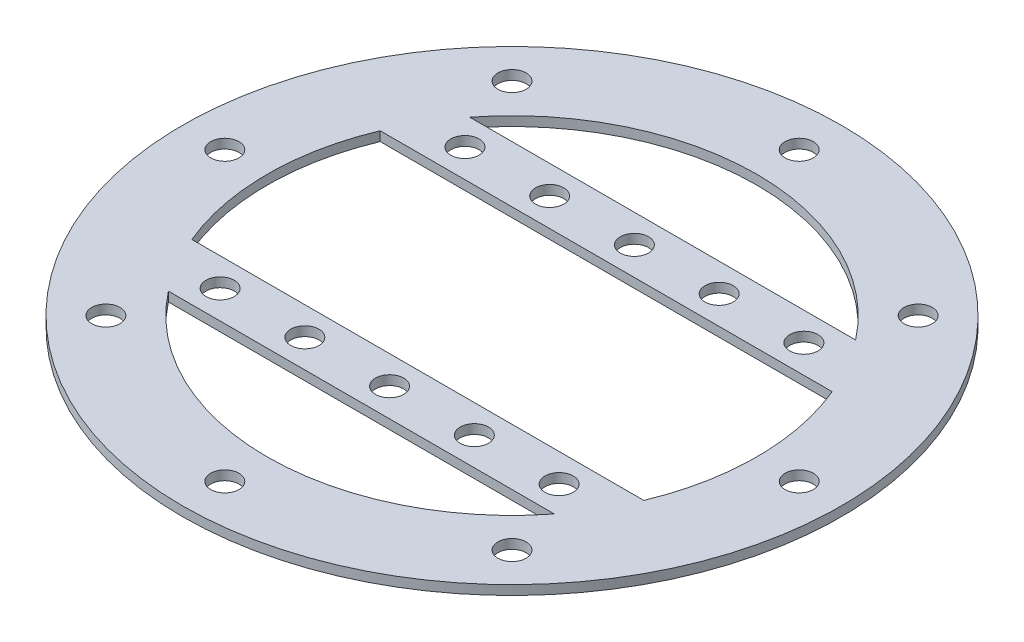
ISO-10303-21;
HEADER;
FILE_DESCRIPTION(('STEP AP214'),'2;1');
FILE_NAME('part.step','',(''),(''),'','','');
FILE_SCHEMA(('AUTOMOTIVE_DESIGN { 1 0 10303 214 1 1 1 1 }'));
ENDSEC;
DATA;
#1=APPLICATION_CONTEXT('core data for automotive mechanical design processes');
#2=APPLICATION_PROTOCOL_DEFINITION('international standard','automotive_design',2000,#1);
#3=PRODUCT_CONTEXT('',#1,'mechanical');
#4=PRODUCT('Part','Part','',(#3));
#5=PRODUCT_RELATED_PRODUCT_CATEGORY('part','',(#4));
#6=PRODUCT_DEFINITION_FORMATION('','',#4);
#7=PRODUCT_DEFINITION_CONTEXT('part definition',#1,'design');
#8=PRODUCT_DEFINITION('design','',#6,#7);
#9=PRODUCT_DEFINITION_SHAPE('','',#8);
#10=(LENGTH_UNIT() NAMED_UNIT(*) SI_UNIT(.MILLI.,.METRE.));
#11=(NAMED_UNIT(*) PLANE_ANGLE_UNIT() SI_UNIT($,.RADIAN.));
#12=(NAMED_UNIT(*) SI_UNIT($,.STERADIAN.) SOLID_ANGLE_UNIT());
#13=UNCERTAINTY_MEASURE_WITH_UNIT(LENGTH_MEASURE(1.E-05),#10,'distance_accuracy_value','');
#14=(GEOMETRIC_REPRESENTATION_CONTEXT(3) GLOBAL_UNCERTAINTY_ASSIGNED_CONTEXT((#13)) GLOBAL_UNIT_ASSIGNED_CONTEXT((#10,
#11,#12)) REPRESENTATION_CONTEXT('',''));
#15=CARTESIAN_POINT('',(0.,0.,0.));
#16=DIRECTION('',(0.,0.,1.));
#17=DIRECTION('',(1.,0.,0.));
#18=AXIS2_PLACEMENT_3D('',#15,#16,#17);
#19=CARTESIAN_POINT('',(0.,1.,-9.99999999999999));
#20=DIRECTION('',(0.,0.,-1.));
#21=DIRECTION('',(-1.,0.,0.));
#22=AXIS2_PLACEMENT_3D('',#19,#20,#21);
#23=PLANE('',#22);
#24=DIRECTION('',(1.,0.,0.));
#25=VECTOR('',#24,1.);
#26=CARTESIAN_POINT('',(0.,0.,-9.99999999999999));
#27=LINE('',#26,#25);
#28=CARTESIAN_POINT('',(-24.,0.,-9.99999999999999));
#29=VERTEX_POINT('',#28);
#30=CARTESIAN_POINT('',(24.,0.,-10.));
#31=VERTEX_POINT('',#30);
#32=EDGE_CURVE('E235',#29,#31,#27,.T.);
#33=ORIENTED_EDGE('',*,*,#32,.T.);
#34=DIRECTION('',(0.,-1.,0.));
#35=VECTOR('',#34,1.);
#36=CARTESIAN_POINT('',(24.,1.,-10.));
#37=LINE('',#36,#35);
#38=CARTESIAN_POINT('',(24.,1.,-10.));
#39=VERTEX_POINT('',#38);
#40=EDGE_CURVE('E11',#39,#31,#37,.T.);
#41=ORIENTED_EDGE('',*,*,#40,.F.);
#42=DIRECTION('',(1.,0.,0.));
#43=VECTOR('',#42,1.);
#44=CARTESIAN_POINT('',(0.,1.,-9.99999999999999));
#45=LINE('',#44,#43);
#46=CARTESIAN_POINT('',(-24.,1.,-9.99999999999999));
#47=VERTEX_POINT('',#46);
#48=EDGE_CURVE('E130',#47,#39,#45,.T.);
#49=ORIENTED_EDGE('',*,*,#48,.F.);
#50=DIRECTION('',(0.,-1.,0.));
#51=VECTOR('',#50,1.);
#52=CARTESIAN_POINT('',(-24.,1.,-9.99999999999999));
#53=LINE('',#52,#51);
#54=EDGE_CURVE('E61',#47,#29,#53,.T.);
#55=ORIENTED_EDGE('',*,*,#54,.T.);
#56=EDGE_LOOP('',(#33,#41,#49,#55));
#57=FACE_BOUND('',#56,.T.);
#58=ADVANCED_FACE('F41',(#57),#23,.F.);
#59=CARTESIAN_POINT('',(0.,1.,0.));
#60=DIRECTION('',(0.,-1.,0.));
#61=DIRECTION('',(0.,0.,-1.));
#62=AXIS2_PLACEMENT_3D('',#59,#60,#61);
#63=CYLINDRICAL_SURFACE('',#62,26.);
#64=CARTESIAN_POINT('',(0.,0.,0.));
#65=DIRECTION('',(0.,1.,0.));
#66=DIRECTION('',(0.,0.,1.));
#67=AXIS2_PLACEMENT_3D('',#64,#65,#66);
#68=CIRCLE('',#67,26.);
#69=CARTESIAN_POINT('',(24.,0.,9.99999999999999));
#70=VERTEX_POINT('',#69);
#71=EDGE_CURVE('E118',#70,#31,#68,.T.);
#72=ORIENTED_EDGE('',*,*,#71,.F.);
#73=DIRECTION('',(0.,-1.,0.));
#74=VECTOR('',#73,1.);
#75=CARTESIAN_POINT('',(24.,1.,9.99999999999999));
#76=LINE('',#75,#74);
#77=CARTESIAN_POINT('',(24.,1.,9.99999999999999));
#78=VERTEX_POINT('',#77);
#79=EDGE_CURVE('E52',#78,#70,#76,.T.);
#80=ORIENTED_EDGE('',*,*,#79,.F.);
#81=CARTESIAN_POINT('',(0.,1.,0.));
#82=DIRECTION('',(0.,1.,0.));
#83=DIRECTION('',(0.,0.,1.));
#84=AXIS2_PLACEMENT_3D('',#81,#82,#83);
#85=CIRCLE('',#84,26.);
#86=EDGE_CURVE('E116',#78,#39,#85,.T.);
#87=ORIENTED_EDGE('',*,*,#86,.T.);
#88=ORIENTED_EDGE('',*,*,#40,.T.);
#89=EDGE_LOOP('',(#72,#80,#87,#88));
#90=FACE_BOUND('',#89,.T.);
#91=ADVANCED_FACE('F115',(#90),#63,.F.);
#92=CARTESIAN_POINT('',(0.,1.,9.99999999999999));
#93=DIRECTION('',(0.,0.,-1.));
#94=DIRECTION('',(-1.,0.,0.));
#95=AXIS2_PLACEMENT_3D('',#92,#93,#94);
#96=PLANE('',#95);
#97=DIRECTION('',(1.,0.,0.));
#98=VECTOR('',#97,1.);
#99=CARTESIAN_POINT('',(0.,0.,9.99999999999999));
#100=LINE('',#99,#98);
#101=CARTESIAN_POINT('',(-24.,0.,10.));
#102=VERTEX_POINT('',#101);
#103=EDGE_CURVE('E238',#102,#70,#100,.T.);
#104=ORIENTED_EDGE('',*,*,#103,.F.);
#105=DIRECTION('',(0.,-1.,0.));
#106=VECTOR('',#105,1.);
#107=CARTESIAN_POINT('',(-24.,1.,10.));
#108=LINE('',#107,#106);
#109=CARTESIAN_POINT('',(-24.,1.,10.));
#110=VERTEX_POINT('',#109);
#111=EDGE_CURVE('E86',#110,#102,#108,.T.);
#112=ORIENTED_EDGE('',*,*,#111,.F.);
#113=DIRECTION('',(1.,0.,0.));
#114=VECTOR('',#113,1.);
#115=CARTESIAN_POINT('',(0.,1.,9.99999999999999));
#116=LINE('',#115,#114);
#117=EDGE_CURVE('E129',#110,#78,#116,.T.);
#118=ORIENTED_EDGE('',*,*,#117,.T.);
#119=ORIENTED_EDGE('',*,*,#79,.T.);
#120=EDGE_LOOP('',(#104,#112,#118,#119));
#121=FACE_BOUND('',#120,.T.);
#122=ADVANCED_FACE('F136',(#121),#96,.T.);
#123=CARTESIAN_POINT('',(20.4939015319192,0.,-16.));
#124=VERTEX_POINT('',#123);
#125=CARTESIAN_POINT('',(-20.4939015319192,0.,-16.));
#126=VERTEX_POINT('',#125);
#127=EDGE_CURVE('E207',#124,#126,#68,.T.);
#128=ORIENTED_EDGE('',*,*,#127,.F.);
#129=DIRECTION('',(0.,-1.,0.));
#130=VECTOR('',#129,1.);
#131=CARTESIAN_POINT('',(20.4939015319192,1.,-16.));
#132=LINE('',#131,#130);
#133=CARTESIAN_POINT('',(20.4939015319192,1.,-16.));
#134=VERTEX_POINT('',#133);
#135=EDGE_CURVE('E299',#134,#124,#132,.T.);
#136=ORIENTED_EDGE('',*,*,#135,.F.);
#137=CARTESIAN_POINT('',(-20.4939015319192,1.,-16.));
#138=VERTEX_POINT('',#137);
#139=EDGE_CURVE('E134',#134,#138,#85,.T.);
#140=ORIENTED_EDGE('',*,*,#139,.T.);
#141=DIRECTION('',(0.,-1.,0.));
#142=VECTOR('',#141,1.);
#143=CARTESIAN_POINT('',(-20.4939015319192,1.,-16.));
#144=LINE('',#143,#142);
#145=EDGE_CURVE('E302',#138,#126,#144,.T.);
#146=ORIENTED_EDGE('',*,*,#145,.T.);
#147=EDGE_LOOP('',(#128,#136,#140,#146));
#148=FACE_BOUND('',#147,.T.);
#149=ADVANCED_FACE('F319',(#148),#63,.F.);
#150=CARTESIAN_POINT('',(-20.4939015319192,0.,16.));
#151=VERTEX_POINT('',#150);
#152=CARTESIAN_POINT('',(20.4939015319192,0.,16.));
#153=VERTEX_POINT('',#152);
#154=EDGE_CURVE('E201',#151,#153,#68,.T.);
#155=ORIENTED_EDGE('',*,*,#154,.F.);
#156=DIRECTION('',(0.,-1.,0.));
#157=VECTOR('',#156,1.);
#158=CARTESIAN_POINT('',(-20.4939015319192,1.,16.));
#159=LINE('',#158,#157);
#160=CARTESIAN_POINT('',(-20.4939015319192,1.,16.));
#161=VERTEX_POINT('',#160);
#162=EDGE_CURVE('E45',#161,#151,#159,.T.);
#163=ORIENTED_EDGE('',*,*,#162,.F.);
#164=CARTESIAN_POINT('',(20.4939015319192,1.,16.));
#165=VERTEX_POINT('',#164);
#166=EDGE_CURVE('E141',#161,#165,#85,.T.);
#167=ORIENTED_EDGE('',*,*,#166,.T.);
#168=DIRECTION('',(0.,-1.,0.));
#169=VECTOR('',#168,1.);
#170=CARTESIAN_POINT('',(20.4939015319192,1.,16.));
#171=LINE('',#170,#169);
#172=EDGE_CURVE('E200',#165,#153,#171,.T.);
#173=ORIENTED_EDGE('',*,*,#172,.T.);
#174=EDGE_LOOP('',(#155,#163,#167,#173));
#175=FACE_BOUND('',#174,.T.);
#176=ADVANCED_FACE('F316',(#175),#63,.F.);
#177=CARTESIAN_POINT('',(-9.,1.,13.));
#178=DIRECTION('',(0.,-1.,0.));
#179=DIRECTION('',(0.,0.,-1.));
#180=AXIS2_PLACEMENT_3D('',#177,#178,#179);
#181=CYLINDRICAL_SURFACE('',#180,1.5);
#182=CARTESIAN_POINT('',(-9.,1.,13.));
#183=DIRECTION('',(0.,1.,0.));
#184=DIRECTION('',(0.,0.,1.));
#185=AXIS2_PLACEMENT_3D('',#182,#183,#184);
#186=CIRCLE('',#185,1.5);
#187=CARTESIAN_POINT('',(-9.,1.,14.5));
#188=VERTEX_POINT('',#187);
#189=EDGE_CURVE('E192',#188,#188,#186,.T.);
#190=ORIENTED_EDGE('',*,*,#189,.T.);
#191=EDGE_LOOP('',(#190));
#192=FACE_BOUND('',#191,.T.);
#193=CARTESIAN_POINT('',(-9.,0.,13.));
#194=DIRECTION('',(0.,1.,0.));
#195=DIRECTION('',(0.,0.,1.));
#196=AXIS2_PLACEMENT_3D('',#193,#194,#195);
#197=CIRCLE('',#196,1.5);
#198=CARTESIAN_POINT('',(-9.,0.,14.5));
#199=VERTEX_POINT('',#198);
#200=EDGE_CURVE('E289',#199,#199,#197,.T.);
#201=ORIENTED_EDGE('',*,*,#200,.F.);
#202=EDGE_LOOP('',(#201));
#203=FACE_BOUND('',#202,.T.);
#204=ADVANCED_FACE('F318',(#192,#203),#181,.F.);
#205=CARTESIAN_POINT('',(0.,1.,13.));
#206=DIRECTION('',(0.,-1.,0.));
#207=DIRECTION('',(0.,0.,-1.));
#208=AXIS2_PLACEMENT_3D('',#205,#206,#207);
#209=CYLINDRICAL_SURFACE('',#208,1.5);
#210=CARTESIAN_POINT('',(0.,1.,13.));
#211=DIRECTION('',(0.,1.,0.));
#212=DIRECTION('',(0.,0.,1.));
#213=AXIS2_PLACEMENT_3D('',#210,#211,#212);
#214=CIRCLE('',#213,1.5);
#215=CARTESIAN_POINT('',(0.,1.,14.5));
#216=VERTEX_POINT('',#215);
#217=EDGE_CURVE('E188',#216,#216,#214,.T.);
#218=ORIENTED_EDGE('',*,*,#217,.T.);
#219=EDGE_LOOP('',(#218));
#220=FACE_BOUND('',#219,.T.);
#221=CARTESIAN_POINT('',(0.,0.,13.));
#222=DIRECTION('',(0.,1.,0.));
#223=DIRECTION('',(0.,0.,1.));
#224=AXIS2_PLACEMENT_3D('',#221,#222,#223);
#225=CIRCLE('',#224,1.5);
#226=CARTESIAN_POINT('',(0.,0.,14.5));
#227=VERTEX_POINT('',#226);
#228=EDGE_CURVE('E285',#227,#227,#225,.T.);
#229=ORIENTED_EDGE('',*,*,#228,.F.);
#230=EDGE_LOOP('',(#229));
#231=FACE_BOUND('',#230,.T.);
#232=ADVANCED_FACE('F326',(#220,#231),#209,.F.);
#233=CARTESIAN_POINT('',(9.,1.,13.));
#234=DIRECTION('',(0.,-1.,0.));
#235=DIRECTION('',(0.,0.,-1.));
#236=AXIS2_PLACEMENT_3D('',#233,#234,#235);
#237=CYLINDRICAL_SURFACE('',#236,1.5);
#238=CARTESIAN_POINT('',(9.,1.,13.));
#239=DIRECTION('',(0.,1.,0.));
#240=DIRECTION('',(0.,0.,1.));
#241=AXIS2_PLACEMENT_3D('',#238,#239,#240);
#242=CIRCLE('',#241,1.5);
#243=CARTESIAN_POINT('',(9.,1.,14.5));
#244=VERTEX_POINT('',#243);
#245=EDGE_CURVE('E184',#244,#244,#242,.T.);
#246=ORIENTED_EDGE('',*,*,#245,.T.);
#247=EDGE_LOOP('',(#246));
#248=FACE_BOUND('',#247,.T.);
#249=CARTESIAN_POINT('',(9.,0.,13.));
#250=DIRECTION('',(0.,1.,0.));
#251=DIRECTION('',(0.,0.,1.));
#252=AXIS2_PLACEMENT_3D('',#249,#250,#251);
#253=CIRCLE('',#252,1.5);
#254=CARTESIAN_POINT('',(9.,0.,14.5));
#255=VERTEX_POINT('',#254);
#256=EDGE_CURVE('E281',#255,#255,#253,.T.);
#257=ORIENTED_EDGE('',*,*,#256,.F.);
#258=EDGE_LOOP('',(#257));
#259=FACE_BOUND('',#258,.T.);
#260=ADVANCED_FACE('F437',(#248,#259),#237,.F.);
#261=CARTESIAN_POINT('',(18.,1.,13.));
#262=DIRECTION('',(0.,-1.,0.));
#263=DIRECTION('',(0.,0.,-1.));
#264=AXIS2_PLACEMENT_3D('',#261,#262,#263);
#265=CYLINDRICAL_SURFACE('',#264,1.5);
#266=CARTESIAN_POINT('',(18.,1.,13.));
#267=DIRECTION('',(0.,1.,0.));
#268=DIRECTION('',(0.,0.,1.));
#269=AXIS2_PLACEMENT_3D('',#266,#267,#268);
#270=CIRCLE('',#269,1.5);
#271=CARTESIAN_POINT('',(18.,1.,14.5));
#272=VERTEX_POINT('',#271);
#273=EDGE_CURVE('E180',#272,#272,#270,.T.);
#274=ORIENTED_EDGE('',*,*,#273,.T.);
#275=EDGE_LOOP('',(#274));
#276=FACE_BOUND('',#275,.T.);
#277=CARTESIAN_POINT('',(18.,0.,13.));
#278=DIRECTION('',(0.,1.,0.));
#279=DIRECTION('',(0.,0.,1.));
#280=AXIS2_PLACEMENT_3D('',#277,#278,#279);
#281=CIRCLE('',#280,1.5);
#282=CARTESIAN_POINT('',(18.,0.,14.5));
#283=VERTEX_POINT('',#282);
#284=EDGE_CURVE('E277',#283,#283,#281,.T.);
#285=ORIENTED_EDGE('',*,*,#284,.F.);
#286=EDGE_LOOP('',(#285));
#287=FACE_BOUND('',#286,.T.);
#288=ADVANCED_FACE('F441',(#276,#287),#265,.F.);
#289=CARTESIAN_POINT('',(0.,1.,0.));
#290=DIRECTION('',(0.,-1.,0.));
#291=DIRECTION('',(0.,0.,-1.));
#292=AXIS2_PLACEMENT_3D('',#289,#290,#291);
#293=CYLINDRICAL_SURFACE('',#292,35.);
#294=CARTESIAN_POINT('',(0.,1.,0.));
#295=DIRECTION('',(0.,1.,0.));
#296=DIRECTION('',(0.,0.,1.));
#297=AXIS2_PLACEMENT_3D('',#294,#295,#296);
#298=CIRCLE('',#297,35.);
#299=CARTESIAN_POINT('',(0.,1.,35.));
#300=VERTEX_POINT('',#299);
#301=EDGE_CURVE('E176',#300,#300,#298,.T.);
#302=ORIENTED_EDGE('',*,*,#301,.F.);
#303=EDGE_LOOP('',(#302));
#304=FACE_BOUND('',#303,.T.);
#305=CARTESIAN_POINT('',(0.,0.,0.));
#306=DIRECTION('',(0.,1.,0.));
#307=DIRECTION('',(0.,0.,1.));
#308=AXIS2_PLACEMENT_3D('',#305,#306,#307);
#309=CIRCLE('',#308,35.);
#310=CARTESIAN_POINT('',(0.,0.,35.));
#311=VERTEX_POINT('',#310);
#312=EDGE_CURVE('E273',#311,#311,#309,.T.);
#313=ORIENTED_EDGE('',*,*,#312,.T.);
#314=EDGE_LOOP('',(#313));
#315=FACE_BOUND('',#314,.T.);
#316=ADVANCED_FACE('F445',(#304,#315),#293,.T.);
#317=CARTESIAN_POINT('',(0.,1.,-30.5));
#318=DIRECTION('',(0.,-1.,0.));
#319=DIRECTION('',(0.,0.,-1.));
#320=AXIS2_PLACEMENT_3D('',#317,#318,#319);
#321=CYLINDRICAL_SURFACE('',#320,1.5);
#322=CARTESIAN_POINT('',(0.,1.,-30.5));
#323=DIRECTION('',(0.,1.,0.));
#324=DIRECTION('',(0.,0.,1.));
#325=AXIS2_PLACEMENT_3D('',#322,#323,#324);
#326=CIRCLE('',#325,1.5);
#327=CARTESIAN_POINT('',(0.,1.,-29.));
#328=VERTEX_POINT('',#327);
#329=EDGE_CURVE('E172',#328,#328,#326,.T.);
#330=ORIENTED_EDGE('',*,*,#329,.T.);
#331=EDGE_LOOP('',(#330));
#332=FACE_BOUND('',#331,.T.);
#333=CARTESIAN_POINT('',(0.,0.,-30.5));
#334=DIRECTION('',(0.,1.,0.));
#335=DIRECTION('',(0.,0.,1.));
#336=AXIS2_PLACEMENT_3D('',#333,#334,#335);
#337=CIRCLE('',#336,1.5);
#338=CARTESIAN_POINT('',(0.,0.,-29.));
#339=VERTEX_POINT('',#338);
#340=EDGE_CURVE('E269',#339,#339,#337,.T.);
#341=ORIENTED_EDGE('',*,*,#340,.F.);
#342=EDGE_LOOP('',(#341));
#343=FACE_BOUND('',#342,.T.);
#344=ADVANCED_FACE('F449',(#332,#343),#321,.F.);
#345=CARTESIAN_POINT('',(21.5667568261903,1.,-21.5667568261912));
#346=DIRECTION('',(0.,-1.,0.));
#347=DIRECTION('',(0.,0.,-1.));
#348=AXIS2_PLACEMENT_3D('',#345,#346,#347);
#349=CYLINDRICAL_SURFACE('',#348,1.5);
#350=CARTESIAN_POINT('',(21.5667568261903,1.,-21.5667568261912));
#351=DIRECTION('',(0.,1.,0.));
#352=DIRECTION('',(0.,0.,1.));
#353=AXIS2_PLACEMENT_3D('',#350,#351,#352);
#354=CIRCLE('',#353,1.5);
#355=CARTESIAN_POINT('',(21.5667568261903,1.,-20.0667568261912));
#356=VERTEX_POINT('',#355);
#357=EDGE_CURVE('E168',#356,#356,#354,.T.);
#358=ORIENTED_EDGE('',*,*,#357,.T.);
#359=EDGE_LOOP('',(#358));
#360=FACE_BOUND('',#359,.T.);
#361=CARTESIAN_POINT('',(21.5667568261903,0.,-21.5667568261912));
#362=DIRECTION('',(0.,1.,0.));
#363=DIRECTION('',(0.,0.,1.));
#364=AXIS2_PLACEMENT_3D('',#361,#362,#363);
#365=CIRCLE('',#364,1.5);
#366=CARTESIAN_POINT('',(21.5667568261903,0.,-20.0667568261912));
#367=VERTEX_POINT('',#366);
#368=EDGE_CURVE('E265',#367,#367,#365,.T.);
#369=ORIENTED_EDGE('',*,*,#368,.F.);
#370=EDGE_LOOP('',(#369));
#371=FACE_BOUND('',#370,.T.);
#372=ADVANCED_FACE('F453',(#360,#371),#349,.F.);
#373=CARTESIAN_POINT('',(30.5000000000022,1.,-2.17205640718744E-12));
#374=DIRECTION('',(0.,-1.,0.));
#375=DIRECTION('',(0.,0.,-1.));
#376=AXIS2_PLACEMENT_3D('',#373,#374,#375);
#377=CYLINDRICAL_SURFACE('',#376,1.5);
#378=CARTESIAN_POINT('',(30.5000000000022,1.,-2.17205640718744E-12));
#379=DIRECTION('',(0.,1.,0.));
#380=DIRECTION('',(0.,0.,1.));
#381=AXIS2_PLACEMENT_3D('',#378,#379,#380);
#382=CIRCLE('',#381,1.5);
#383=CARTESIAN_POINT('',(30.5000000000022,1.,1.49999999999783));
#384=VERTEX_POINT('',#383);
#385=EDGE_CURVE('E164',#384,#384,#382,.T.);
#386=ORIENTED_EDGE('',*,*,#385,.T.);
#387=EDGE_LOOP('',(#386));
#388=FACE_BOUND('',#387,.T.);
#389=CARTESIAN_POINT('',(30.5000000000022,0.,-2.17205640718744E-12));
#390=DIRECTION('',(0.,1.,0.));
#391=DIRECTION('',(0.,0.,1.));
#392=AXIS2_PLACEMENT_3D('',#389,#390,#391);
#393=CIRCLE('',#392,1.5);
#394=CARTESIAN_POINT('',(30.5000000000022,0.,1.49999999999783));
#395=VERTEX_POINT('',#394);
#396=EDGE_CURVE('E261',#395,#395,#393,.T.);
#397=ORIENTED_EDGE('',*,*,#396,.F.);
#398=EDGE_LOOP('',(#397));
#399=FACE_BOUND('',#398,.T.);
#400=ADVANCED_FACE('F457',(#388,#399),#377,.F.);
#401=CARTESIAN_POINT('',(21.5667568261934,1.,21.5667568261882));
#402=DIRECTION('',(0.,-1.,0.));
#403=DIRECTION('',(0.,0.,-1.));
#404=AXIS2_PLACEMENT_3D('',#401,#402,#403);
#405=CYLINDRICAL_SURFACE('',#404,1.5);
#406=CARTESIAN_POINT('',(21.5667568261934,1.,21.5667568261882));
#407=DIRECTION('',(0.,1.,0.));
#408=DIRECTION('',(0.,0.,1.));
#409=AXIS2_PLACEMENT_3D('',#406,#407,#408);
#410=CIRCLE('',#409,1.5);
#411=CARTESIAN_POINT('',(21.5667568261934,1.,23.0667568261882));
#412=VERTEX_POINT('',#411);
#413=EDGE_CURVE('E160',#412,#412,#410,.T.);
#414=ORIENTED_EDGE('',*,*,#413,.T.);
#415=EDGE_LOOP('',(#414));
#416=FACE_BOUND('',#415,.T.);
#417=CARTESIAN_POINT('',(21.5667568261934,0.,21.5667568261882));
#418=DIRECTION('',(0.,1.,0.));
#419=DIRECTION('',(0.,0.,1.));
#420=AXIS2_PLACEMENT_3D('',#417,#418,#419);
#421=CIRCLE('',#420,1.5);
#422=CARTESIAN_POINT('',(21.5667568261934,0.,23.0667568261882));
#423=VERTEX_POINT('',#422);
#424=EDGE_CURVE('E257',#423,#423,#421,.T.);
#425=ORIENTED_EDGE('',*,*,#424,.F.);
#426=EDGE_LOOP('',(#425));
#427=FACE_BOUND('',#426,.T.);
#428=ADVANCED_FACE('F461',(#416,#427),#405,.F.);
#429=CARTESIAN_POINT('',(4.34405158203492E-12,1.,30.5));
#430=DIRECTION('',(0.,-1.,0.));
#431=DIRECTION('',(0.,0.,-1.));
#432=AXIS2_PLACEMENT_3D('',#429,#430,#431);
#433=CYLINDRICAL_SURFACE('',#432,1.5);
#434=CARTESIAN_POINT('',(4.34405158203492E-12,1.,30.5));
#435=DIRECTION('',(0.,1.,0.));
#436=DIRECTION('',(0.,0.,1.));
#437=AXIS2_PLACEMENT_3D('',#434,#435,#436);
#438=CIRCLE('',#437,1.5);
#439=CARTESIAN_POINT('',(4.34405158203492E-12,1.,32.));
#440=VERTEX_POINT('',#439);
#441=EDGE_CURVE('E156',#440,#440,#438,.T.);
#442=ORIENTED_EDGE('',*,*,#441,.T.);
#443=EDGE_LOOP('',(#442));
#444=FACE_BOUND('',#443,.T.);
#445=CARTESIAN_POINT('',(4.34405158203492E-12,0.,30.5));
#446=DIRECTION('',(0.,1.,0.));
#447=DIRECTION('',(0.,0.,1.));
#448=AXIS2_PLACEMENT_3D('',#445,#446,#447);
#449=CIRCLE('',#448,1.5);
#450=CARTESIAN_POINT('',(4.34405158203492E-12,0.,32.));
#451=VERTEX_POINT('',#450);
#452=EDGE_CURVE('E253',#451,#451,#449,.T.);
#453=ORIENTED_EDGE('',*,*,#452,.F.);
#454=EDGE_LOOP('',(#453));
#455=FACE_BOUND('',#454,.T.);
#456=ADVANCED_FACE('F465',(#444,#455),#433,.F.);
#457=CARTESIAN_POINT('',(-21.566756826186,1.,21.5667568261912));
#458=DIRECTION('',(0.,-1.,0.));
#459=DIRECTION('',(0.,0.,-1.));
#460=AXIS2_PLACEMENT_3D('',#457,#458,#459);
#461=CYLINDRICAL_SURFACE('',#460,1.5);
#462=CARTESIAN_POINT('',(-21.566756826186,1.,21.5667568261912));
#463=DIRECTION('',(0.,1.,0.));
#464=DIRECTION('',(0.,0.,1.));
#465=AXIS2_PLACEMENT_3D('',#462,#463,#464);
#466=CIRCLE('',#465,1.5);
#467=CARTESIAN_POINT('',(-21.566756826186,1.,23.0667568261912));
#468=VERTEX_POINT('',#467);
#469=EDGE_CURVE('E152',#468,#468,#466,.T.);
#470=ORIENTED_EDGE('',*,*,#469,.T.);
#471=EDGE_LOOP('',(#470));
#472=FACE_BOUND('',#471,.T.);
#473=CARTESIAN_POINT('',(-21.566756826186,0.,21.5667568261912));
#474=DIRECTION('',(0.,1.,0.));
#475=DIRECTION('',(0.,0.,1.));
#476=AXIS2_PLACEMENT_3D('',#473,#474,#475);
#477=CIRCLE('',#476,1.5);
#478=CARTESIAN_POINT('',(-21.566756826186,0.,23.0667568261912));
#479=VERTEX_POINT('',#478);
#480=EDGE_CURVE('E249',#479,#479,#477,.T.);
#481=ORIENTED_EDGE('',*,*,#480,.F.);
#482=EDGE_LOOP('',(#481));
#483=FACE_BOUND('',#482,.T.);
#484=ADVANCED_FACE('F469',(#472,#483),#461,.F.);
#485=CARTESIAN_POINT('',(-30.4999999999978,1.,2.17579157992484E-12));
#486=DIRECTION('',(0.,-1.,0.));
#487=DIRECTION('',(0.,0.,-1.));
#488=AXIS2_PLACEMENT_3D('',#485,#486,#487);
#489=CYLINDRICAL_SURFACE('',#488,1.5);
#490=CARTESIAN_POINT('',(-30.4999999999978,1.,2.17579157992484E-12));
#491=DIRECTION('',(0.,1.,0.));
#492=DIRECTION('',(0.,0.,1.));
#493=AXIS2_PLACEMENT_3D('',#490,#491,#492);
#494=CIRCLE('',#493,1.5);
#495=CARTESIAN_POINT('',(-30.4999999999978,1.,1.50000000000218));
#496=VERTEX_POINT('',#495);
#497=EDGE_CURVE('E148',#496,#496,#494,.T.);
#498=ORIENTED_EDGE('',*,*,#497,.T.);
#499=EDGE_LOOP('',(#498));
#500=FACE_BOUND('',#499,.T.);
#501=CARTESIAN_POINT('',(-30.4999999999978,0.,2.17579157992484E-12));
#502=DIRECTION('',(0.,1.,0.));
#503=DIRECTION('',(0.,0.,1.));
#504=AXIS2_PLACEMENT_3D('',#501,#502,#503);
#505=CIRCLE('',#504,1.5);
#506=CARTESIAN_POINT('',(-30.4999999999978,0.,1.50000000000218));
#507=VERTEX_POINT('',#506);
#508=EDGE_CURVE('E245',#507,#507,#505,.T.);
#509=ORIENTED_EDGE('',*,*,#508,.F.);
#510=EDGE_LOOP('',(#509));
#511=FACE_BOUND('',#510,.T.);
#512=ADVANCED_FACE('F473',(#500,#511),#489,.F.);
#513=CARTESIAN_POINT('',(-21.5667568261891,1.,-21.5667568261882));
#514=DIRECTION('',(0.,-1.,0.));
#515=DIRECTION('',(0.,0.,-1.));
#516=AXIS2_PLACEMENT_3D('',#513,#514,#515);
#517=CYLINDRICAL_SURFACE('',#516,1.5);
#518=CARTESIAN_POINT('',(-21.5667568261891,1.,-21.5667568261882));
#519=DIRECTION('',(0.,1.,0.));
#520=DIRECTION('',(0.,0.,1.));
#521=AXIS2_PLACEMENT_3D('',#518,#519,#520);
#522=CIRCLE('',#521,1.5);
#523=CARTESIAN_POINT('',(-21.5667568261891,1.,-20.0667568261882));
#524=VERTEX_POINT('',#523);
#525=EDGE_CURVE('E140',#524,#524,#522,.T.);
#526=ORIENTED_EDGE('',*,*,#525,.T.);
#527=EDGE_LOOP('',(#526));
#528=FACE_BOUND('',#527,.T.);
#529=CARTESIAN_POINT('',(-21.5667568261891,0.,-21.5667568261882));
#530=DIRECTION('',(0.,1.,0.));
#531=DIRECTION('',(0.,0.,1.));
#532=AXIS2_PLACEMENT_3D('',#529,#530,#531);
#533=CIRCLE('',#532,1.5);
#534=CARTESIAN_POINT('',(-21.5667568261891,0.,-20.0667568261882));
#535=VERTEX_POINT('',#534);
#536=EDGE_CURVE('E241',#535,#535,#533,.T.);
#537=ORIENTED_EDGE('',*,*,#536,.F.);
#538=EDGE_LOOP('',(#537));
#539=FACE_BOUND('',#538,.T.);
#540=ADVANCED_FACE('F334',(#528,#539),#517,.F.);
#541=EDGE_CURVE('E206',#29,#102,#68,.T.);
#542=ORIENTED_EDGE('',*,*,#541,.F.);
#543=ORIENTED_EDGE('',*,*,#54,.F.);
#544=EDGE_CURVE('E135',#47,#110,#85,.T.);
#545=ORIENTED_EDGE('',*,*,#544,.T.);
#546=ORIENTED_EDGE('',*,*,#111,.T.);
#547=EDGE_LOOP('',(#542,#543,#545,#546));
#548=FACE_BOUND('',#547,.T.);
#549=ADVANCED_FACE('F321',(#548),#63,.F.);
#550=CARTESIAN_POINT('',(-9.,1.,-13.));
#551=DIRECTION('',(0.,-1.,0.));
#552=DIRECTION('',(0.,0.,-1.));
#553=AXIS2_PLACEMENT_3D('',#550,#551,#552);
#554=CYLINDRICAL_SURFACE('',#553,1.5);
#555=CARTESIAN_POINT('',(-9.,1.,-13.));
#556=DIRECTION('',(0.,1.,0.));
#557=DIRECTION('',(0.,0.,1.));
#558=AXIS2_PLACEMENT_3D('',#555,#556,#557);
#559=CIRCLE('',#558,1.5);
#560=CARTESIAN_POINT('',(-9.,1.,-11.5));
#561=VERTEX_POINT('',#560);
#562=EDGE_CURVE('E379',#561,#561,#559,.T.);
#563=ORIENTED_EDGE('',*,*,#562,.T.);
#564=EDGE_LOOP('',(#563));
#565=FACE_BOUND('',#564,.T.);
#566=CARTESIAN_POINT('',(-9.,0.,-13.));
#567=DIRECTION('',(0.,1.,0.));
#568=DIRECTION('',(0.,0.,1.));
#569=AXIS2_PLACEMENT_3D('',#566,#567,#568);
#570=CIRCLE('',#569,1.5);
#571=CARTESIAN_POINT('',(-9.,0.,-11.5));
#572=VERTEX_POINT('',#571);
#573=EDGE_CURVE('E231',#572,#572,#570,.T.);
#574=ORIENTED_EDGE('',*,*,#573,.F.);
#575=EDGE_LOOP('',(#574));
#576=FACE_BOUND('',#575,.T.);
#577=ADVANCED_FACE('F333',(#565,#576),#554,.F.);
#578=CARTESIAN_POINT('',(0.,1.,-13.));
#579=DIRECTION('',(0.,-1.,0.));
#580=DIRECTION('',(0.,0.,-1.));
#581=AXIS2_PLACEMENT_3D('',#578,#579,#580);
#582=CYLINDRICAL_SURFACE('',#581,1.5);
#583=CARTESIAN_POINT('',(0.,1.,-13.));
#584=DIRECTION('',(0.,1.,0.));
#585=DIRECTION('',(0.,0.,1.));
#586=AXIS2_PLACEMENT_3D('',#583,#584,#585);
#587=CIRCLE('',#586,1.5);
#588=CARTESIAN_POINT('',(0.,1.,-11.5));
#589=VERTEX_POINT('',#588);
#590=EDGE_CURVE('E382',#589,#589,#587,.T.);
#591=ORIENTED_EDGE('',*,*,#590,.T.);
#592=EDGE_LOOP('',(#591));
#593=FACE_BOUND('',#592,.T.);
#594=CARTESIAN_POINT('',(0.,0.,-13.));
#595=DIRECTION('',(0.,1.,0.));
#596=DIRECTION('',(0.,0.,1.));
#597=AXIS2_PLACEMENT_3D('',#594,#595,#596);
#598=CIRCLE('',#597,1.5);
#599=CARTESIAN_POINT('',(0.,0.,-11.5));
#600=VERTEX_POINT('',#599);
#601=EDGE_CURVE('E227',#600,#600,#598,.T.);
#602=ORIENTED_EDGE('',*,*,#601,.F.);
#603=EDGE_LOOP('',(#602));
#604=FACE_BOUND('',#603,.T.);
#605=ADVANCED_FACE('F343',(#593,#604),#582,.F.);
#606=CARTESIAN_POINT('',(9.,1.,-13.));
#607=DIRECTION('',(0.,-1.,0.));
#608=DIRECTION('',(0.,0.,-1.));
#609=AXIS2_PLACEMENT_3D('',#606,#607,#608);
#610=CYLINDRICAL_SURFACE('',#609,1.5);
#611=CARTESIAN_POINT('',(9.,1.,-13.));
#612=DIRECTION('',(0.,1.,0.));
#613=DIRECTION('',(0.,0.,1.));
#614=AXIS2_PLACEMENT_3D('',#611,#612,#613);
#615=CIRCLE('',#614,1.5);
#616=CARTESIAN_POINT('',(9.,1.,-11.5));
#617=VERTEX_POINT('',#616);
#618=EDGE_CURVE('E386',#617,#617,#615,.T.);
#619=ORIENTED_EDGE('',*,*,#618,.T.);
#620=EDGE_LOOP('',(#619));
#621=FACE_BOUND('',#620,.T.);
#622=CARTESIAN_POINT('',(9.,0.,-13.));
#623=DIRECTION('',(0.,1.,0.));
#624=DIRECTION('',(0.,0.,1.));
#625=AXIS2_PLACEMENT_3D('',#622,#623,#624);
#626=CIRCLE('',#625,1.5);
#627=CARTESIAN_POINT('',(9.,0.,-11.5));
#628=VERTEX_POINT('',#627);
#629=EDGE_CURVE('E223',#628,#628,#626,.T.);
#630=ORIENTED_EDGE('',*,*,#629,.F.);
#631=EDGE_LOOP('',(#630));
#632=FACE_BOUND('',#631,.T.);
#633=ADVANCED_FACE('F347',(#621,#632),#610,.F.);
#634=CARTESIAN_POINT('',(18.,1.,-13.));
#635=DIRECTION('',(0.,-1.,0.));
#636=DIRECTION('',(0.,0.,-1.));
#637=AXIS2_PLACEMENT_3D('',#634,#635,#636);
#638=CYLINDRICAL_SURFACE('',#637,1.5);
#639=CARTESIAN_POINT('',(18.,1.,-13.));
#640=DIRECTION('',(0.,1.,0.));
#641=DIRECTION('',(0.,0.,1.));
#642=AXIS2_PLACEMENT_3D('',#639,#640,#641);
#643=CIRCLE('',#642,1.5);
#644=CARTESIAN_POINT('',(18.,1.,-11.5));
#645=VERTEX_POINT('',#644);
#646=EDGE_CURVE('E392',#645,#645,#643,.T.);
#647=ORIENTED_EDGE('',*,*,#646,.T.);
#648=EDGE_LOOP('',(#647));
#649=FACE_BOUND('',#648,.T.);
#650=CARTESIAN_POINT('',(18.,0.,-13.));
#651=DIRECTION('',(0.,1.,0.));
#652=DIRECTION('',(0.,0.,1.));
#653=AXIS2_PLACEMENT_3D('',#650,#651,#652);
#654=CIRCLE('',#653,1.5);
#655=CARTESIAN_POINT('',(18.,0.,-11.5));
#656=VERTEX_POINT('',#655);
#657=EDGE_CURVE('E219',#656,#656,#654,.T.);
#658=ORIENTED_EDGE('',*,*,#657,.F.);
#659=EDGE_LOOP('',(#658));
#660=FACE_BOUND('',#659,.T.);
#661=ADVANCED_FACE('F351',(#649,#660),#638,.F.);
#662=CARTESIAN_POINT('',(-18.,1.,-13.));
#663=DIRECTION('',(0.,-1.,0.));
#664=DIRECTION('',(0.,0.,-1.));
#665=AXIS2_PLACEMENT_3D('',#662,#663,#664);
#666=CYLINDRICAL_SURFACE('',#665,1.5);
#667=CARTESIAN_POINT('',(-18.,1.,-13.));
#668=DIRECTION('',(0.,1.,0.));
#669=DIRECTION('',(0.,0.,1.));
#670=AXIS2_PLACEMENT_3D('',#667,#668,#669);
#671=CIRCLE('',#670,1.5);
#672=CARTESIAN_POINT('',(-18.,1.,-11.5));
#673=VERTEX_POINT('',#672);
#674=EDGE_CURVE('E396',#673,#673,#671,.T.);
#675=ORIENTED_EDGE('',*,*,#674,.T.);
#676=EDGE_LOOP('',(#675));
#677=FACE_BOUND('',#676,.T.);
#678=CARTESIAN_POINT('',(-18.,0.,-13.));
#679=DIRECTION('',(0.,1.,0.));
#680=DIRECTION('',(0.,0.,1.));
#681=AXIS2_PLACEMENT_3D('',#678,#679,#680);
#682=CIRCLE('',#681,1.5);
#683=CARTESIAN_POINT('',(-18.,0.,-11.5));
#684=VERTEX_POINT('',#683);
#685=EDGE_CURVE('E215',#684,#684,#682,.T.);
#686=ORIENTED_EDGE('',*,*,#685,.F.);
#687=EDGE_LOOP('',(#686));
#688=FACE_BOUND('',#687,.T.);
#689=ADVANCED_FACE('F355',(#677,#688),#666,.F.);
#690=CARTESIAN_POINT('',(0.,1.,-16.));
#691=DIRECTION('',(0.,0.,-1.));
#692=DIRECTION('',(-1.,0.,0.));
#693=AXIS2_PLACEMENT_3D('',#690,#691,#692);
#694=PLANE('',#693);
#695=DIRECTION('',(1.,0.,0.));
#696=VECTOR('',#695,1.);
#697=CARTESIAN_POINT('',(0.,0.,-16.));
#698=LINE('',#697,#696);
#699=EDGE_CURVE('E211',#126,#124,#698,.T.);
#700=ORIENTED_EDGE('',*,*,#699,.F.);
#701=ORIENTED_EDGE('',*,*,#145,.F.);
#702=DIRECTION('',(1.,0.,0.));
#703=VECTOR('',#702,1.);
#704=CARTESIAN_POINT('',(0.,1.,-16.));
#705=LINE('',#704,#703);
#706=EDGE_CURVE('E400',#138,#134,#705,.T.);
#707=ORIENTED_EDGE('',*,*,#706,.T.);
#708=ORIENTED_EDGE('',*,*,#135,.T.);
#709=EDGE_LOOP('',(#700,#701,#707,#708));
#710=FACE_BOUND('',#709,.T.);
#711=ADVANCED_FACE('F358',(#710),#694,.T.);
#712=CARTESIAN_POINT('',(0.,1.,16.));
#713=DIRECTION('',(0.,0.,-1.));
#714=DIRECTION('',(-1.,0.,0.));
#715=AXIS2_PLACEMENT_3D('',#712,#713,#714);
#716=PLANE('',#715);
#717=DIRECTION('',(1.,0.,0.));
#718=VECTOR('',#717,1.);
#719=CARTESIAN_POINT('',(0.,0.,16.));
#720=LINE('',#719,#718);
#721=EDGE_CURVE('E205',#151,#153,#720,.T.);
#722=ORIENTED_EDGE('',*,*,#721,.T.);
#723=ORIENTED_EDGE('',*,*,#172,.F.);
#724=DIRECTION('',(1.,0.,0.));
#725=VECTOR('',#724,1.);
#726=CARTESIAN_POINT('',(0.,1.,16.));
#727=LINE('',#726,#725);
#728=EDGE_CURVE('E311',#161,#165,#727,.T.);
#729=ORIENTED_EDGE('',*,*,#728,.F.);
#730=ORIENTED_EDGE('',*,*,#162,.T.);
#731=EDGE_LOOP('',(#722,#723,#729,#730));
#732=FACE_BOUND('',#731,.T.);
#733=ADVANCED_FACE('F43',(#732),#716,.F.);
#734=CARTESIAN_POINT('',(-18.,1.,13.));
#735=DIRECTION('',(0.,-1.,0.));
#736=DIRECTION('',(0.,0.,-1.));
#737=AXIS2_PLACEMENT_3D('',#734,#735,#736);
#738=CYLINDRICAL_SURFACE('',#737,1.5);
#739=CARTESIAN_POINT('',(-18.,1.,13.));
#740=DIRECTION('',(0.,1.,0.));
#741=DIRECTION('',(0.,0.,1.));
#742=AXIS2_PLACEMENT_3D('',#739,#740,#741);
#743=CIRCLE('',#742,1.5);
#744=CARTESIAN_POINT('',(-18.,1.,14.5));
#745=VERTEX_POINT('',#744);
#746=EDGE_CURVE('E196',#745,#745,#743,.T.);
#747=ORIENTED_EDGE('',*,*,#746,.T.);
#748=EDGE_LOOP('',(#747));
#749=FACE_BOUND('',#748,.T.);
#750=CARTESIAN_POINT('',(-18.,0.,13.));
#751=DIRECTION('',(0.,1.,0.));
#752=DIRECTION('',(0.,0.,1.));
#753=AXIS2_PLACEMENT_3D('',#750,#751,#752);
#754=CIRCLE('',#753,1.5);
#755=CARTESIAN_POINT('',(-18.,0.,14.5));
#756=VERTEX_POINT('',#755);
#757=EDGE_CURVE('E293',#756,#756,#754,.T.);
#758=ORIENTED_EDGE('',*,*,#757,.F.);
#759=EDGE_LOOP('',(#758));
#760=FACE_BOUND('',#759,.T.);
#761=ADVANCED_FACE('F365',(#749,#760),#738,.F.);
#762=CARTESIAN_POINT('',(0.,1.,0.));
#763=DIRECTION('',(0.,1.,0.));
#764=DIRECTION('',(0.,0.,1.));
#765=AXIS2_PLACEMENT_3D('',#762,#763,#764);
#766=PLANE('',#765);
#767=ORIENTED_EDGE('',*,*,#166,.F.);
#768=ORIENTED_EDGE('',*,*,#728,.T.);
#769=EDGE_LOOP('',(#767,#768));
#770=FACE_BOUND('',#769,.T.);
#771=ORIENTED_EDGE('',*,*,#139,.F.);
#772=ORIENTED_EDGE('',*,*,#706,.F.);
#773=EDGE_LOOP('',(#771,#772));
#774=FACE_BOUND('',#773,.T.);
#775=ORIENTED_EDGE('',*,*,#674,.F.);
#776=EDGE_LOOP('',(#775));
#777=FACE_BOUND('',#776,.T.);
#778=ORIENTED_EDGE('',*,*,#646,.F.);
#779=EDGE_LOOP('',(#778));
#780=FACE_BOUND('',#779,.T.);
#781=ORIENTED_EDGE('',*,*,#618,.F.);
#782=EDGE_LOOP('',(#781));
#783=FACE_BOUND('',#782,.T.);
#784=ORIENTED_EDGE('',*,*,#590,.F.);
#785=EDGE_LOOP('',(#784));
#786=FACE_BOUND('',#785,.T.);
#787=ORIENTED_EDGE('',*,*,#562,.F.);
#788=EDGE_LOOP('',(#787));
#789=FACE_BOUND('',#788,.T.);
#790=ORIENTED_EDGE('',*,*,#48,.T.);
#791=ORIENTED_EDGE('',*,*,#86,.F.);
#792=ORIENTED_EDGE('',*,*,#117,.F.);
#793=ORIENTED_EDGE('',*,*,#544,.F.);
#794=EDGE_LOOP('',(#790,#791,#792,#793));
#795=FACE_BOUND('',#794,.T.);
#796=ORIENTED_EDGE('',*,*,#525,.F.);
#797=EDGE_LOOP('',(#796));
#798=FACE_BOUND('',#797,.T.);
#799=ORIENTED_EDGE('',*,*,#497,.F.);
#800=EDGE_LOOP('',(#799));
#801=FACE_BOUND('',#800,.T.);
#802=ORIENTED_EDGE('',*,*,#469,.F.);
#803=EDGE_LOOP('',(#802));
#804=FACE_BOUND('',#803,.T.);
#805=ORIENTED_EDGE('',*,*,#441,.F.);
#806=EDGE_LOOP('',(#805));
#807=FACE_BOUND('',#806,.T.);
#808=ORIENTED_EDGE('',*,*,#413,.F.);
#809=EDGE_LOOP('',(#808));
#810=FACE_BOUND('',#809,.T.);
#811=ORIENTED_EDGE('',*,*,#385,.F.);
#812=EDGE_LOOP('',(#811));
#813=FACE_BOUND('',#812,.T.);
#814=ORIENTED_EDGE('',*,*,#357,.F.);
#815=EDGE_LOOP('',(#814));
#816=FACE_BOUND('',#815,.T.);
#817=ORIENTED_EDGE('',*,*,#329,.F.);
#818=EDGE_LOOP('',(#817));
#819=FACE_BOUND('',#818,.T.);
#820=ORIENTED_EDGE('',*,*,#301,.T.);
#821=EDGE_LOOP('',(#820));
#822=FACE_BOUND('',#821,.T.);
#823=ORIENTED_EDGE('',*,*,#273,.F.);
#824=EDGE_LOOP('',(#823));
#825=FACE_BOUND('',#824,.T.);
#826=ORIENTED_EDGE('',*,*,#245,.F.);
#827=EDGE_LOOP('',(#826));
#828=FACE_BOUND('',#827,.T.);
#829=ORIENTED_EDGE('',*,*,#217,.F.);
#830=EDGE_LOOP('',(#829));
#831=FACE_BOUND('',#830,.T.);
#832=ORIENTED_EDGE('',*,*,#189,.F.);
#833=EDGE_LOOP('',(#832));
#834=FACE_BOUND('',#833,.T.);
#835=ORIENTED_EDGE('',*,*,#746,.F.);
#836=EDGE_LOOP('',(#835));
#837=FACE_BOUND('',#836,.T.);
#838=ADVANCED_FACE('F126',(#770,#774,#777,#780,#783,#786,#789,#795,#798,#801,#804,#807,#810,
#813,#816,#819,#822,#825,#828,#831,#834,#837),#766,.T.);
#839=CARTESIAN_POINT('',(0.,0.,0.));
#840=DIRECTION('',(0.,1.,0.));
#841=DIRECTION('',(0.,0.,1.));
#842=AXIS2_PLACEMENT_3D('',#839,#840,#841);
#843=PLANE('',#842);
#844=ORIENTED_EDGE('',*,*,#154,.T.);
#845=ORIENTED_EDGE('',*,*,#721,.F.);
#846=EDGE_LOOP('',(#844,#845));
#847=FACE_BOUND('',#846,.T.);
#848=ORIENTED_EDGE('',*,*,#127,.T.);
#849=ORIENTED_EDGE('',*,*,#699,.T.);
#850=EDGE_LOOP('',(#848,#849));
#851=FACE_BOUND('',#850,.T.);
#852=ORIENTED_EDGE('',*,*,#685,.T.);
#853=EDGE_LOOP('',(#852));
#854=FACE_BOUND('',#853,.T.);
#855=ORIENTED_EDGE('',*,*,#657,.T.);
#856=EDGE_LOOP('',(#855));
#857=FACE_BOUND('',#856,.T.);
#858=ORIENTED_EDGE('',*,*,#629,.T.);
#859=EDGE_LOOP('',(#858));
#860=FACE_BOUND('',#859,.T.);
#861=ORIENTED_EDGE('',*,*,#601,.T.);
#862=EDGE_LOOP('',(#861));
#863=FACE_BOUND('',#862,.T.);
#864=ORIENTED_EDGE('',*,*,#573,.T.);
#865=EDGE_LOOP('',(#864));
#866=FACE_BOUND('',#865,.T.);
#867=ORIENTED_EDGE('',*,*,#32,.F.);
#868=ORIENTED_EDGE('',*,*,#541,.T.);
#869=ORIENTED_EDGE('',*,*,#103,.T.);
#870=ORIENTED_EDGE('',*,*,#71,.T.);
#871=EDGE_LOOP('',(#867,#868,#869,#870));
#872=FACE_BOUND('',#871,.T.);
#873=ORIENTED_EDGE('',*,*,#536,.T.);
#874=EDGE_LOOP('',(#873));
#875=FACE_BOUND('',#874,.T.);
#876=ORIENTED_EDGE('',*,*,#508,.T.);
#877=EDGE_LOOP('',(#876));
#878=FACE_BOUND('',#877,.T.);
#879=ORIENTED_EDGE('',*,*,#480,.T.);
#880=EDGE_LOOP('',(#879));
#881=FACE_BOUND('',#880,.T.);
#882=ORIENTED_EDGE('',*,*,#452,.T.);
#883=EDGE_LOOP('',(#882));
#884=FACE_BOUND('',#883,.T.);
#885=ORIENTED_EDGE('',*,*,#424,.T.);
#886=EDGE_LOOP('',(#885));
#887=FACE_BOUND('',#886,.T.);
#888=ORIENTED_EDGE('',*,*,#396,.T.);
#889=EDGE_LOOP('',(#888));
#890=FACE_BOUND('',#889,.T.);
#891=ORIENTED_EDGE('',*,*,#368,.T.);
#892=EDGE_LOOP('',(#891));
#893=FACE_BOUND('',#892,.T.);
#894=ORIENTED_EDGE('',*,*,#340,.T.);
#895=EDGE_LOOP('',(#894));
#896=FACE_BOUND('',#895,.T.);
#897=ORIENTED_EDGE('',*,*,#312,.F.);
#898=EDGE_LOOP('',(#897));
#899=FACE_BOUND('',#898,.T.);
#900=ORIENTED_EDGE('',*,*,#284,.T.);
#901=EDGE_LOOP('',(#900));
#902=FACE_BOUND('',#901,.T.);
#903=ORIENTED_EDGE('',*,*,#256,.T.);
#904=EDGE_LOOP('',(#903));
#905=FACE_BOUND('',#904,.T.);
#906=ORIENTED_EDGE('',*,*,#228,.T.);
#907=EDGE_LOOP('',(#906));
#908=FACE_BOUND('',#907,.T.);
#909=ORIENTED_EDGE('',*,*,#200,.T.);
#910=EDGE_LOOP('',(#909));
#911=FACE_BOUND('',#910,.T.);
#912=ORIENTED_EDGE('',*,*,#757,.T.);
#913=EDGE_LOOP('',(#912));
#914=FACE_BOUND('',#913,.T.);
#915=ADVANCED_FACE('F314',(#847,#851,#854,#857,#860,#863,#866,#872,#875,#878,#881,#884,#887,
#890,#893,#896,#899,#902,#905,#908,#911,#914),#843,.F.);
#916=CLOSED_SHELL('',(#58,#91,#122,#149,#176,#204,#232,#260,#288,#316,#344,#372,#400,#428,#456,
#484,#512,#540,#549,#577,#605,#633,#661,#689,#711,#733,#761,#838,#915));
#917=MANIFOLD_SOLID_BREP('B2',#916);
#918=ADVANCED_BREP_SHAPE_REPRESENTATION('',(#18,#917),#14);
#919=SHAPE_DEFINITION_REPRESENTATION(#9,#918);
ENDSEC;
END-ISO-10303-21;
